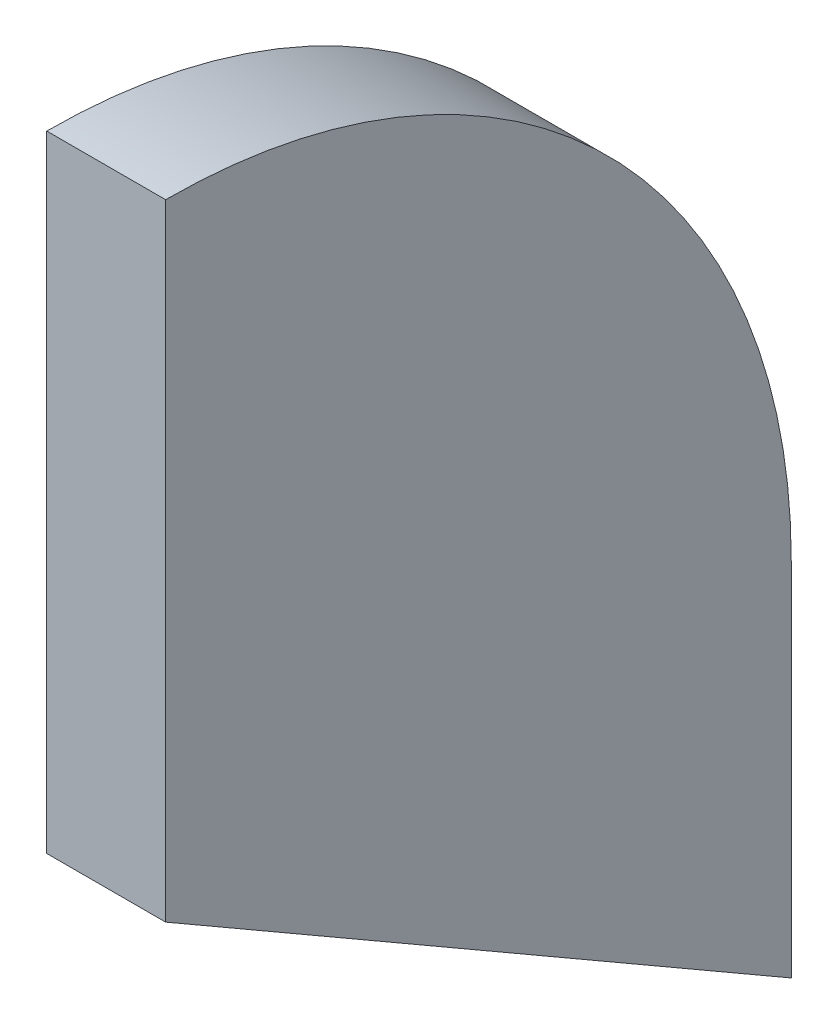
ISO-10303-21;
HEADER;
FILE_DESCRIPTION(('STEP AP214'),'2;1');
FILE_NAME('part.step','',(''),(''),'','','');
FILE_SCHEMA(('AUTOMOTIVE_DESIGN { 1 0 10303 214 1 1 1 1 }'));
ENDSEC;
DATA;
#1=APPLICATION_CONTEXT('core data for automotive mechanical design processes');
#2=APPLICATION_PROTOCOL_DEFINITION('international standard','automotive_design',2000,#1);
#3=PRODUCT_CONTEXT('',#1,'mechanical');
#4=PRODUCT('Part','Part','',(#3));
#5=PRODUCT_RELATED_PRODUCT_CATEGORY('part','',(#4));
#6=PRODUCT_DEFINITION_FORMATION('','',#4);
#7=PRODUCT_DEFINITION_CONTEXT('part definition',#1,'design');
#8=PRODUCT_DEFINITION('design','',#6,#7);
#9=PRODUCT_DEFINITION_SHAPE('','',#8);
#10=(LENGTH_UNIT() NAMED_UNIT(*) SI_UNIT(.MILLI.,.METRE.));
#11=(NAMED_UNIT(*) PLANE_ANGLE_UNIT() SI_UNIT($,.RADIAN.));
#12=(NAMED_UNIT(*) SI_UNIT($,.STERADIAN.) SOLID_ANGLE_UNIT());
#13=UNCERTAINTY_MEASURE_WITH_UNIT(LENGTH_MEASURE(1.E-05),#10,'distance_accuracy_value','');
#14=(GEOMETRIC_REPRESENTATION_CONTEXT(3) GLOBAL_UNCERTAINTY_ASSIGNED_CONTEXT((#13)) GLOBAL_UNIT_ASSIGNED_CONTEXT((#10,
#11,#12)) REPRESENTATION_CONTEXT('',''));
#15=CARTESIAN_POINT('',(0.,0.,0.));
#16=DIRECTION('',(0.,0.,1.));
#17=DIRECTION('',(1.,0.,0.));
#18=AXIS2_PLACEMENT_3D('',#15,#16,#17);
#19=CARTESIAN_POINT('',(289.5,0.,0.));
#20=DIRECTION('',(0.,0.,1.));
#21=DIRECTION('',(0.,-1.,0.));
#22=AXIS2_PLACEMENT_3D('',#19,#20,#21);
#23=PLANE('',#22);
#24=DIRECTION('',(0.,1.,0.));
#25=VECTOR('',#24,1.);
#26=CARTESIAN_POINT('',(270.5,0.,0.));
#27=LINE('',#26,#25);
#28=CARTESIAN_POINT('',(270.5,0.,0.));
#29=VERTEX_POINT('',#28);
#30=CARTESIAN_POINT('',(270.5,100.,0.));
#31=VERTEX_POINT('',#30);
#32=EDGE_CURVE('E97',#29,#31,#27,.T.);
#33=ORIENTED_EDGE('',*,*,#32,.F.);
#34=DIRECTION('',(-1.,0.,0.));
#35=VECTOR('',#34,1.);
#36=CARTESIAN_POINT('',(289.5,0.,0.));
#37=LINE('',#36,#35);
#38=CARTESIAN_POINT('',(289.5,0.,0.));
#39=VERTEX_POINT('',#38);
#40=EDGE_CURVE('E11',#39,#29,#37,.T.);
#41=ORIENTED_EDGE('',*,*,#40,.F.);
#42=DIRECTION('',(0.,1.,0.));
#43=VECTOR('',#42,1.);
#44=CARTESIAN_POINT('',(289.5,0.,0.));
#45=LINE('',#44,#43);
#46=CARTESIAN_POINT('',(289.5,100.,0.));
#47=VERTEX_POINT('',#46);
#48=EDGE_CURVE('E91',#39,#47,#45,.T.);
#49=ORIENTED_EDGE('',*,*,#48,.T.);
#50=DIRECTION('',(-1.,0.,0.));
#51=VECTOR('',#50,1.);
#52=CARTESIAN_POINT('',(289.5,100.,0.));
#53=LINE('',#52,#51);
#54=EDGE_CURVE('E36',#47,#31,#53,.T.);
#55=ORIENTED_EDGE('',*,*,#54,.T.);
#56=EDGE_LOOP('',(#33,#41,#49,#55));
#57=FACE_BOUND('',#56,.T.);
#58=ADVANCED_FACE('F33',(#57),#23,.T.);
#59=CARTESIAN_POINT('',(289.5,-57.7350269189626,-100.));
#60=DIRECTION('',(0.,-0.866025403784439,0.5));
#61=DIRECTION('',(0.,-0.5,-0.866025403784439));
#62=AXIS2_PLACEMENT_3D('',#59,#60,#61);
#63=PLANE('',#62);
#64=DIRECTION('',(0.,0.5,0.866025403784438));
#65=VECTOR('',#64,1.);
#66=CARTESIAN_POINT('',(270.5,-57.7350269189626,-100.));
#67=LINE('',#66,#65);
#68=CARTESIAN_POINT('',(270.5,-57.7350269189626,-100.));
#69=VERTEX_POINT('',#68);
#70=EDGE_CURVE('E93',#69,#29,#67,.T.);
#71=ORIENTED_EDGE('',*,*,#70,.F.);
#72=DIRECTION('',(-1.,0.,0.));
#73=VECTOR('',#72,1.);
#74=CARTESIAN_POINT('',(289.5,-57.7350269189626,-100.));
#75=LINE('',#74,#73);
#76=CARTESIAN_POINT('',(289.5,-57.7350269189626,-100.));
#77=VERTEX_POINT('',#76);
#78=EDGE_CURVE('E42',#77,#69,#75,.T.);
#79=ORIENTED_EDGE('',*,*,#78,.F.);
#80=DIRECTION('',(0.,0.5,0.866025403784438));
#81=VECTOR('',#80,1.);
#82=CARTESIAN_POINT('',(289.5,-57.7350269189626,-100.));
#83=LINE('',#82,#81);
#84=EDGE_CURVE('E88',#77,#39,#83,.T.);
#85=ORIENTED_EDGE('',*,*,#84,.T.);
#86=ORIENTED_EDGE('',*,*,#40,.T.);
#87=EDGE_LOOP('',(#71,#79,#85,#86));
#88=FACE_BOUND('',#87,.T.);
#89=ADVANCED_FACE('F107',(#88),#63,.T.);
#90=CARTESIAN_POINT('',(289.5,0.,-100.));
#91=DIRECTION('',(0.,0.,-1.));
#92=DIRECTION('',(-1.,0.,0.));
#93=AXIS2_PLACEMENT_3D('',#90,#91,#92);
#94=PLANE('',#93);
#95=DIRECTION('',(0.,-1.,0.));
#96=VECTOR('',#95,1.);
#97=CARTESIAN_POINT('',(270.5,0.,-100.));
#98=LINE('',#97,#96);
#99=CARTESIAN_POINT('',(270.5,0.,-100.));
#100=VERTEX_POINT('',#99);
#101=EDGE_CURVE('E83',#100,#69,#98,.T.);
#102=ORIENTED_EDGE('',*,*,#101,.F.);
#103=DIRECTION('',(-1.,0.,0.));
#104=VECTOR('',#103,1.);
#105=CARTESIAN_POINT('',(289.5,0.,-100.));
#106=LINE('',#105,#104);
#107=CARTESIAN_POINT('',(289.5,0.,-100.));
#108=VERTEX_POINT('',#107);
#109=EDGE_CURVE('E78',#108,#100,#106,.T.);
#110=ORIENTED_EDGE('',*,*,#109,.F.);
#111=DIRECTION('',(0.,-1.,0.));
#112=VECTOR('',#111,1.);
#113=CARTESIAN_POINT('',(289.5,0.,-100.));
#114=LINE('',#113,#112);
#115=EDGE_CURVE('E81',#108,#77,#114,.T.);
#116=ORIENTED_EDGE('',*,*,#115,.T.);
#117=ORIENTED_EDGE('',*,*,#78,.T.);
#118=EDGE_LOOP('',(#102,#110,#116,#117));
#119=FACE_BOUND('',#118,.T.);
#120=ADVANCED_FACE('F80',(#119),#94,.T.);
#121=CARTESIAN_POINT('',(289.5,0.,0.));
#122=DIRECTION('',(-1.,0.,0.));
#123=DIRECTION('',(0.,0.,1.));
#124=AXIS2_PLACEMENT_3D('',#121,#122,#123);
#125=CYLINDRICAL_SURFACE('',#124,100.);
#126=CARTESIAN_POINT('',(270.5,0.,0.));
#127=DIRECTION('',(-1.,0.,0.));
#128=DIRECTION('',(0.,0.,1.));
#129=AXIS2_PLACEMENT_3D('',#126,#127,#128);
#130=CIRCLE('',#129,100.);
#131=EDGE_CURVE('E100',#31,#100,#130,.T.);
#132=ORIENTED_EDGE('',*,*,#131,.F.);
#133=ORIENTED_EDGE('',*,*,#54,.F.);
#134=CARTESIAN_POINT('',(289.5,0.,0.));
#135=DIRECTION('',(-1.,0.,0.));
#136=DIRECTION('',(0.,0.,1.));
#137=AXIS2_PLACEMENT_3D('',#134,#135,#136);
#138=CIRCLE('',#137,100.);
#139=EDGE_CURVE('E87',#47,#108,#138,.T.);
#140=ORIENTED_EDGE('',*,*,#139,.T.);
#141=ORIENTED_EDGE('',*,*,#109,.T.);
#142=EDGE_LOOP('',(#132,#133,#140,#141));
#143=FACE_BOUND('',#142,.T.);
#144=ADVANCED_FACE('F90',(#143),#125,.T.);
#145=CARTESIAN_POINT('',(289.5,0.,0.));
#146=DIRECTION('',(-1.,0.,0.));
#147=DIRECTION('',(0.,0.,1.));
#148=AXIS2_PLACEMENT_3D('',#145,#146,#147);
#149=PLANE('',#148);
#150=ORIENTED_EDGE('',*,*,#48,.F.);
#151=ORIENTED_EDGE('',*,*,#84,.F.);
#152=ORIENTED_EDGE('',*,*,#115,.F.);
#153=ORIENTED_EDGE('',*,*,#139,.F.);
#154=EDGE_LOOP('',(#150,#151,#152,#153));
#155=FACE_BOUND('',#154,.T.);
#156=ADVANCED_FACE('F86',(#155),#149,.F.);
#157=CARTESIAN_POINT('',(270.5,0.,0.));
#158=DIRECTION('',(-1.,0.,0.));
#159=DIRECTION('',(0.,0.,1.));
#160=AXIS2_PLACEMENT_3D('',#157,#158,#159);
#161=PLANE('',#160);
#162=ORIENTED_EDGE('',*,*,#32,.T.);
#163=ORIENTED_EDGE('',*,*,#131,.T.);
#164=ORIENTED_EDGE('',*,*,#101,.T.);
#165=ORIENTED_EDGE('',*,*,#70,.T.);
#166=EDGE_LOOP('',(#162,#163,#164,#165));
#167=FACE_BOUND('',#166,.T.);
#168=ADVANCED_FACE('F106',(#167),#161,.T.);
#169=CLOSED_SHELL('',(#58,#89,#120,#144,#156,#168));
#170=MANIFOLD_SOLID_BREP('B2',#169);
#171=ADVANCED_BREP_SHAPE_REPRESENTATION('',(#18,#170),#14);
#172=SHAPE_DEFINITION_REPRESENTATION(#9,#171);
ENDSEC;
END-ISO-10303-21;
